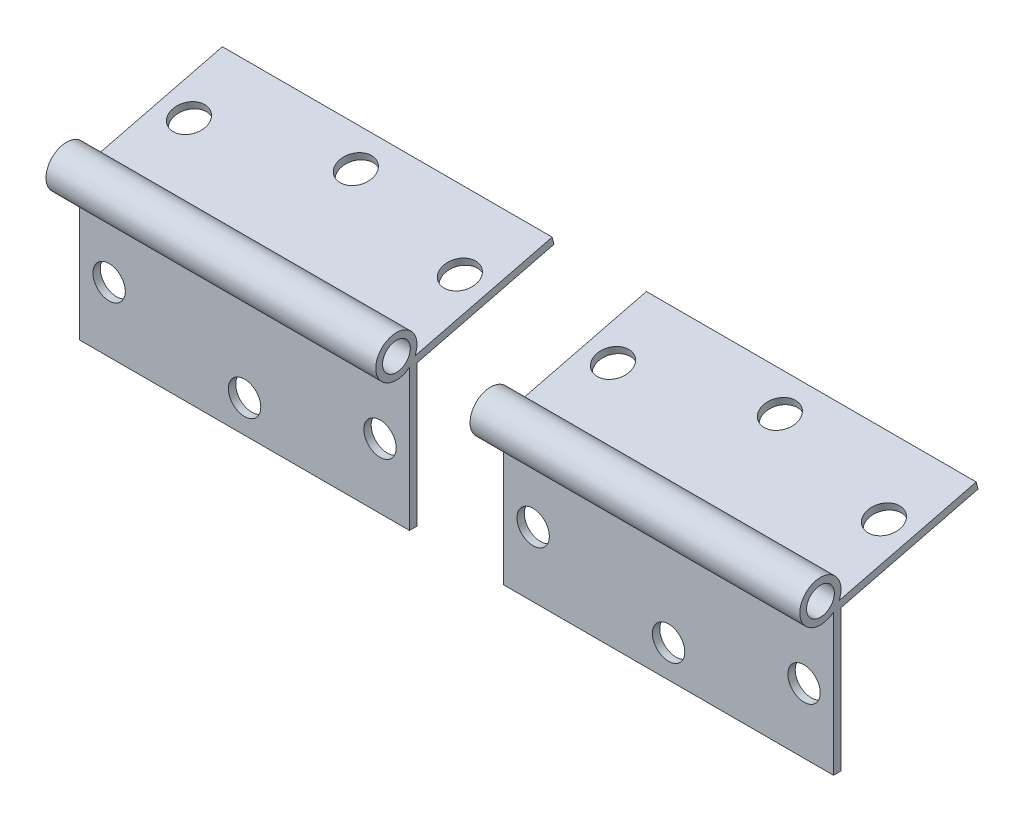
ISO-10303-21;
HEADER;
FILE_DESCRIPTION(('STEP AP214'),'2;1');
FILE_NAME('part.step','',(''),(''),'','','');
FILE_SCHEMA(('AUTOMOTIVE_DESIGN { 1 0 10303 214 1 1 1 1 }'));
ENDSEC;
DATA;
#1=APPLICATION_CONTEXT('core data for automotive mechanical design processes');
#2=APPLICATION_PROTOCOL_DEFINITION('international standard','automotive_design',2000,#1);
#3=PRODUCT_CONTEXT('',#1,'mechanical');
#4=PRODUCT('Part','Part','',(#3));
#5=PRODUCT_RELATED_PRODUCT_CATEGORY('part','',(#4));
#6=PRODUCT_DEFINITION_FORMATION('','',#4);
#7=PRODUCT_DEFINITION_CONTEXT('part definition',#1,'design');
#8=PRODUCT_DEFINITION('design','',#6,#7);
#9=PRODUCT_DEFINITION_SHAPE('','',#8);
#10=(LENGTH_UNIT() NAMED_UNIT(*) SI_UNIT(.MILLI.,.METRE.));
#11=(NAMED_UNIT(*) PLANE_ANGLE_UNIT() SI_UNIT($,.RADIAN.));
#12=(NAMED_UNIT(*) SI_UNIT($,.STERADIAN.) SOLID_ANGLE_UNIT());
#13=UNCERTAINTY_MEASURE_WITH_UNIT(LENGTH_MEASURE(1.E-05),#10,'distance_accuracy_value','');
#14=(GEOMETRIC_REPRESENTATION_CONTEXT(3) GLOBAL_UNCERTAINTY_ASSIGNED_CONTEXT((#13)) GLOBAL_UNIT_ASSIGNED_CONTEXT((#10,
#11,#12)) REPRESENTATION_CONTEXT('',''));
#15=CARTESIAN_POINT('',(0.,0.,0.));
#16=DIRECTION('',(0.,0.,1.));
#17=DIRECTION('',(1.,0.,0.));
#18=AXIS2_PLACEMENT_3D('',#15,#16,#17);
#19=CARTESIAN_POINT('',(101.6,0.,0.));
#20=DIRECTION('',(-1.,0.,0.));
#21=DIRECTION('',(0.,0.,1.));
#22=AXIS2_PLACEMENT_3D('',#19,#20,#21);
#23=CYLINDRICAL_SURFACE('',#22,3.75065009492908);
#24=CARTESIAN_POINT('',(-101.6,0.,0.));
#25=DIRECTION('',(1.,0.,0.));
#26=DIRECTION('',(0.,0.,-1.));
#27=AXIS2_PLACEMENT_3D('',#24,#25,#26);
#28=CIRCLE('',#27,3.75065009492908);
#29=CARTESIAN_POINT('',(-101.6,0.,-3.75065009492908));
#30=VERTEX_POINT('',#29);
#31=EDGE_CURVE('E122',#30,#30,#28,.T.);
#32=ORIENTED_EDGE('',*,*,#31,.F.);
#33=EDGE_LOOP('',(#32));
#34=FACE_BOUND('',#33,.T.);
#35=CARTESIAN_POINT('',(-12.7,0.,0.));
#36=DIRECTION('',(-1.,0.,0.));
#37=DIRECTION('',(0.,0.,1.));
#38=AXIS2_PLACEMENT_3D('',#35,#36,#37);
#39=CIRCLE('',#38,3.75065009492908);
#40=CARTESIAN_POINT('',(-12.7,0.,3.75065009492908));
#41=VERTEX_POINT('',#40);
#42=EDGE_CURVE('E12',#41,#41,#39,.T.);
#43=ORIENTED_EDGE('',*,*,#42,.F.);
#44=EDGE_LOOP('',(#43));
#45=FACE_BOUND('',#44,.T.);
#46=ADVANCED_FACE('F43',(#34,#45),#23,.F.);
#47=CARTESIAN_POINT('',(101.6,0.,0.));
#48=DIRECTION('',(-1.,0.,0.));
#49=DIRECTION('',(0.,0.,1.));
#50=AXIS2_PLACEMENT_3D('',#47,#48,#49);
#51=CYLINDRICAL_SURFACE('',#50,5.55625);
#52=CARTESIAN_POINT('',(-12.7,0.,0.));
#53=DIRECTION('',(-1.,0.,0.));
#54=DIRECTION('',(0.,0.,1.));
#55=AXIS2_PLACEMENT_3D('',#52,#53,#54);
#56=CIRCLE('',#55,5.55625);
#57=CARTESIAN_POINT('',(-12.7,-4.29976832770399,-3.51907749141357));
#58=VERTEX_POINT('',#57);
#59=CARTESIAN_POINT('',(-12.7,-2.37433774587505,-5.02338872983298));
#60=VERTEX_POINT('',#59);
#61=EDGE_CURVE('E60',#58,#60,#56,.T.);
#62=ORIENTED_EDGE('',*,*,#61,.T.);
#63=DIRECTION('',(-1.,0.,0.));
#64=VECTOR('',#63,1.);
#65=CARTESIAN_POINT('',(101.6,-2.37433774587505,-5.02338872983297));
#66=LINE('',#65,#64);
#67=CARTESIAN_POINT('',(-101.6,-2.37433774587505,-5.02338872983297));
#68=VERTEX_POINT('',#67);
#69=EDGE_CURVE('E174',#60,#68,#66,.T.);
#70=ORIENTED_EDGE('',*,*,#69,.T.);
#71=CARTESIAN_POINT('',(-101.6,0.,0.));
#72=DIRECTION('',(1.,0.,0.));
#73=DIRECTION('',(0.,0.,-1.));
#74=AXIS2_PLACEMENT_3D('',#71,#72,#73);
#75=CIRCLE('',#74,5.55625);
#76=CARTESIAN_POINT('',(-101.6,-4.29976832770398,-3.51907749141357));
#77=VERTEX_POINT('',#76);
#78=EDGE_CURVE('E136',#68,#77,#75,.T.);
#79=ORIENTED_EDGE('',*,*,#78,.T.);
#80=DIRECTION('',(-1.,0.,0.));
#81=VECTOR('',#80,1.);
#82=CARTESIAN_POINT('',(101.6,-4.29976832770398,-3.51907749141357));
#83=LINE('',#82,#81);
#84=EDGE_CURVE('E138',#58,#77,#83,.T.);
#85=ORIENTED_EDGE('',*,*,#84,.F.);
#86=EDGE_LOOP('',(#62,#70,#79,#85));
#87=FACE_BOUND('',#86,.T.);
#88=ADVANCED_FACE('F201',(#87),#51,.T.);
#89=CARTESIAN_POINT('',(101.6,0.,-3.51907749141357));
#90=DIRECTION('',(0.,0.,1.));
#91=DIRECTION('',(1.,0.,0.));
#92=AXIS2_PLACEMENT_3D('',#89,#90,#91);
#93=PLANE('',#92);
#94=CARTESIAN_POINT('',(-57.15,-33.668518327704,-3.51907749141357));
#95=DIRECTION('',(0.,0.,1.));
#96=DIRECTION('',(1.,0.,0.));
#97=AXIS2_PLACEMENT_3D('',#94,#95,#96);
#98=CIRCLE('',#97,4.365625);
#99=CARTESIAN_POINT('',(-52.784375,-33.668518327704,-3.51907749141357));
#100=VERTEX_POINT('',#99);
#101=EDGE_CURVE('E182',#100,#100,#98,.T.);
#102=ORIENTED_EDGE('',*,*,#101,.F.);
#103=EDGE_LOOP('',(#102));
#104=FACE_BOUND('',#103,.T.);
#105=CARTESIAN_POINT('',(-20.6375,-24.937268327704,-3.51907749141357));
#106=DIRECTION('',(0.,0.,1.));
#107=DIRECTION('',(1.,0.,0.));
#108=AXIS2_PLACEMENT_3D('',#105,#106,#107);
#109=CIRCLE('',#108,4.365625);
#110=CARTESIAN_POINT('',(-16.271875,-24.937268327704,-3.51907749141357));
#111=VERTEX_POINT('',#110);
#112=EDGE_CURVE('E188',#111,#111,#109,.T.);
#113=ORIENTED_EDGE('',*,*,#112,.F.);
#114=EDGE_LOOP('',(#113));
#115=FACE_BOUND('',#114,.T.);
#116=CARTESIAN_POINT('',(-93.6625,-24.937268327704,-3.51907749141357));
#117=DIRECTION('',(0.,0.,1.));
#118=DIRECTION('',(1.,0.,0.));
#119=AXIS2_PLACEMENT_3D('',#116,#117,#118);
#120=CIRCLE('',#119,4.365625);
#121=CARTESIAN_POINT('',(-89.296875,-24.937268327704,-3.51907749141357));
#122=VERTEX_POINT('',#121);
#123=EDGE_CURVE('E129',#122,#122,#120,.T.);
#124=ORIENTED_EDGE('',*,*,#123,.F.);
#125=EDGE_LOOP('',(#124));
#126=FACE_BOUND('',#125,.T.);
#127=DIRECTION('',(0.,-1.,0.));
#128=VECTOR('',#127,1.);
#129=CARTESIAN_POINT('',(-12.7,0.,-3.51907749141357));
#130=LINE('',#129,#128);
#131=CARTESIAN_POINT('',(-12.7,-42.399768327704,-3.51907749141357));
#132=VERTEX_POINT('',#131);
#133=EDGE_CURVE('E52',#58,#132,#130,.T.);
#134=ORIENTED_EDGE('',*,*,#133,.F.);
#135=ORIENTED_EDGE('',*,*,#84,.T.);
#136=DIRECTION('',(0.,1.,0.));
#137=VECTOR('',#136,1.);
#138=CARTESIAN_POINT('',(-101.6,0.,-3.51907749141357));
#139=LINE('',#138,#137);
#140=CARTESIAN_POINT('',(-101.6,-42.399768327704,-3.51907749141357));
#141=VERTEX_POINT('',#140);
#142=EDGE_CURVE('E133',#141,#77,#139,.T.);
#143=ORIENTED_EDGE('',*,*,#142,.F.);
#144=DIRECTION('',(-1.,0.,0.));
#145=VECTOR('',#144,1.);
#146=CARTESIAN_POINT('',(101.6,-42.399768327704,-3.51907749141357));
#147=LINE('',#146,#145);
#148=EDGE_CURVE('E118',#132,#141,#147,.T.);
#149=ORIENTED_EDGE('',*,*,#148,.F.);
#150=EDGE_LOOP('',(#134,#135,#143,#149));
#151=FACE_BOUND('',#150,.T.);
#152=ADVANCED_FACE('F151',(#104,#115,#126,#151),#93,.T.);
#153=CARTESIAN_POINT('',(101.6,-42.399768327704,0.));
#154=DIRECTION('',(0.,-1.,0.));
#155=DIRECTION('',(0.,0.,-1.));
#156=AXIS2_PLACEMENT_3D('',#153,#154,#155);
#157=PLANE('',#156);
#158=DIRECTION('',(0.,0.,1.));
#159=VECTOR('',#158,1.);
#160=CARTESIAN_POINT('',(-12.7,-42.399768327704,-5.50345249141358));
#161=LINE('',#160,#159);
#162=CARTESIAN_POINT('',(-12.7,-42.399768327704,-5.50345249141358));
#163=VERTEX_POINT('',#162);
#164=EDGE_CURVE('E117',#163,#132,#161,.T.);
#165=ORIENTED_EDGE('',*,*,#164,.T.);
#166=ORIENTED_EDGE('',*,*,#148,.T.);
#167=DIRECTION('',(0.,0.,1.));
#168=VECTOR('',#167,1.);
#169=CARTESIAN_POINT('',(-101.6,-42.399768327704,0.));
#170=LINE('',#169,#168);
#171=CARTESIAN_POINT('',(-101.6,-42.399768327704,-5.50345249141358));
#172=VERTEX_POINT('',#171);
#173=EDGE_CURVE('E124',#172,#141,#170,.T.);
#174=ORIENTED_EDGE('',*,*,#173,.F.);
#175=DIRECTION('',(-1.,0.,0.));
#176=VECTOR('',#175,1.);
#177=CARTESIAN_POINT('',(101.6,-42.399768327704,-5.50345249141358));
#178=LINE('',#177,#176);
#179=EDGE_CURVE('E76',#163,#172,#178,.T.);
#180=ORIENTED_EDGE('',*,*,#179,.F.);
#181=EDGE_LOOP('',(#165,#166,#174,#180));
#182=FACE_BOUND('',#181,.T.);
#183=ADVANCED_FACE('F149',(#182),#157,.T.);
#184=CARTESIAN_POINT('',(101.6,0.,-5.50345249141358));
#185=DIRECTION('',(0.,0.,1.));
#186=DIRECTION('',(1.,0.,0.));
#187=AXIS2_PLACEMENT_3D('',#184,#185,#186);
#188=PLANE('',#187);
#189=CARTESIAN_POINT('',(-57.15,-33.668518327704,-5.50345249141358));
#190=DIRECTION('',(0.,0.,1.));
#191=DIRECTION('',(1.,0.,0.));
#192=AXIS2_PLACEMENT_3D('',#189,#190,#191);
#193=CIRCLE('',#192,4.365625);
#194=CARTESIAN_POINT('',(-52.784375,-33.668518327704,-5.50345249141358));
#195=VERTEX_POINT('',#194);
#196=EDGE_CURVE('E172',#195,#195,#193,.T.);
#197=ORIENTED_EDGE('',*,*,#196,.T.);
#198=EDGE_LOOP('',(#197));
#199=FACE_BOUND('',#198,.T.);
#200=CARTESIAN_POINT('',(-20.6375,-24.937268327704,-5.50345249141358));
#201=DIRECTION('',(0.,0.,1.));
#202=DIRECTION('',(1.,0.,0.));
#203=AXIS2_PLACEMENT_3D('',#200,#201,#202);
#204=CIRCLE('',#203,4.365625);
#205=CARTESIAN_POINT('',(-16.271875,-24.937268327704,-5.50345249141358));
#206=VERTEX_POINT('',#205);
#207=EDGE_CURVE('E185',#206,#206,#204,.T.);
#208=ORIENTED_EDGE('',*,*,#207,.T.);
#209=EDGE_LOOP('',(#208));
#210=FACE_BOUND('',#209,.T.);
#211=CARTESIAN_POINT('',(-93.6625,-24.937268327704,-5.50345249141358));
#212=DIRECTION('',(0.,0.,1.));
#213=DIRECTION('',(1.,0.,0.));
#214=AXIS2_PLACEMENT_3D('',#211,#212,#213);
#215=CIRCLE('',#214,4.365625);
#216=CARTESIAN_POINT('',(-89.296875,-24.937268327704,-5.50345249141358));
#217=VERTEX_POINT('',#216);
#218=EDGE_CURVE('E190',#217,#217,#215,.T.);
#219=ORIENTED_EDGE('',*,*,#218,.T.);
#220=EDGE_LOOP('',(#219));
#221=FACE_BOUND('',#220,.T.);
#222=DIRECTION('',(-1.,0.,0.));
#223=VECTOR('',#222,1.);
#224=CARTESIAN_POINT('',(101.6,-4.29976832770399,-5.50345249141358));
#225=LINE('',#224,#223);
#226=CARTESIAN_POINT('',(-12.7,-4.29976832770398,-5.50345249141358));
#227=VERTEX_POINT('',#226);
#228=CARTESIAN_POINT('',(-101.6,-4.29976832770398,-5.50345249141358));
#229=VERTEX_POINT('',#228);
#230=EDGE_CURVE('E46',#227,#229,#225,.T.);
#231=ORIENTED_EDGE('',*,*,#230,.F.);
#232=DIRECTION('',(0.,-1.,0.));
#233=VECTOR('',#232,1.);
#234=CARTESIAN_POINT('',(-12.7,-42.399768327704,-5.50345249141358));
#235=LINE('',#234,#233);
#236=EDGE_CURVE('E114',#227,#163,#235,.T.);
#237=ORIENTED_EDGE('',*,*,#236,.T.);
#238=ORIENTED_EDGE('',*,*,#179,.T.);
#239=DIRECTION('',(0.,1.,0.));
#240=VECTOR('',#239,1.);
#241=CARTESIAN_POINT('',(-101.6,0.,-5.50345249141358));
#242=LINE('',#241,#240);
#243=EDGE_CURVE('E121',#172,#229,#242,.T.);
#244=ORIENTED_EDGE('',*,*,#243,.T.);
#245=EDGE_LOOP('',(#231,#237,#238,#244));
#246=FACE_BOUND('',#245,.T.);
#247=ADVANCED_FACE('F120',(#199,#210,#221,#246),#188,.F.);
#248=CARTESIAN_POINT('',(-101.6,0.,0.));
#249=DIRECTION('',(1.,0.,0.));
#250=DIRECTION('',(0.,0.,-1.));
#251=AXIS2_PLACEMENT_3D('',#248,#249,#250);
#252=PLANE('',#251);
#253=ORIENTED_EDGE('',*,*,#31,.T.);
#254=EDGE_LOOP('',(#253));
#255=FACE_BOUND('',#254,.T.);
#256=ORIENTED_EDGE('',*,*,#78,.F.);
#257=DIRECTION('',(0.,-0.241921895599674,0.970295726275995));
#258=VECTOR('',#257,1.);
#259=CARTESIAN_POINT('',(-101.6,-3.41454585035264,-0.851341897484917));
#260=LINE('',#259,#258);
#261=CARTESIAN_POINT('',(-101.6,6.84288647647254,-41.9916559009484));
#262=VERTEX_POINT('',#261);
#263=EDGE_CURVE('E160',#262,#68,#260,.T.);
#264=ORIENTED_EDGE('',*,*,#263,.F.);
#265=DIRECTION('',(0.,0.970295726275995,0.241921895599674));
#266=VECTOR('',#265,1.);
#267=CARTESIAN_POINT('',(-101.6,10.2574323268252,-41.1403140034635));
#268=LINE('',#267,#266);
#269=CARTESIAN_POINT('',(-101.6,4.9174558946436,-42.471719662529));
#270=VERTEX_POINT('',#269);
#271=EDGE_CURVE('E158',#270,#262,#268,.T.);
#272=ORIENTED_EDGE('',*,*,#271,.F.);
#273=DIRECTION('',(0.,-0.241921895599674,0.970295726275995));
#274=VECTOR('',#273,1.);
#275=CARTESIAN_POINT('',(-101.6,-5.33997643218157,-1.33140565906552));
#276=LINE('',#275,#274);
#277=EDGE_CURVE('E156',#270,#229,#276,.T.);
#278=ORIENTED_EDGE('',*,*,#277,.T.);
#279=ORIENTED_EDGE('',*,*,#243,.F.);
#280=ORIENTED_EDGE('',*,*,#173,.T.);
#281=ORIENTED_EDGE('',*,*,#142,.T.);
#282=EDGE_LOOP('',(#256,#264,#272,#278,#279,#280,#281));
#283=FACE_BOUND('',#282,.T.);
#284=ADVANCED_FACE('F154',(#255,#283),#252,.F.);
#285=CARTESIAN_POINT('',(-12.7,-42.399768327704,-5.50345249141358));
#286=DIRECTION('',(-1.,0.,0.));
#287=DIRECTION('',(0.,0.,1.));
#288=AXIS2_PLACEMENT_3D('',#285,#286,#287);
#289=PLANE('',#288);
#290=DIRECTION('',(0.,0.241921895599674,-0.970295726275995));
#291=VECTOR('',#290,1.);
#292=CARTESIAN_POINT('',(-12.7,-3.41454585035264,-0.851341897484917));
#293=LINE('',#292,#291);
#294=CARTESIAN_POINT('',(-12.7,6.84288647647253,-41.9916559009484));
#295=VERTEX_POINT('',#294);
#296=EDGE_CURVE('E169',#60,#295,#293,.T.);
#297=ORIENTED_EDGE('',*,*,#296,.F.);
#298=ORIENTED_EDGE('',*,*,#61,.F.);
#299=ORIENTED_EDGE('',*,*,#133,.T.);
#300=ORIENTED_EDGE('',*,*,#164,.F.);
#301=ORIENTED_EDGE('',*,*,#236,.F.);
#302=DIRECTION('',(0.,0.241921895599674,-0.970295726275995));
#303=VECTOR('',#302,1.);
#304=CARTESIAN_POINT('',(-12.7,4.9174558946436,-42.471719662529));
#305=LINE('',#304,#303);
#306=CARTESIAN_POINT('',(-12.7,4.9174558946436,-42.471719662529));
#307=VERTEX_POINT('',#306);
#308=EDGE_CURVE('E105',#227,#307,#305,.T.);
#309=ORIENTED_EDGE('',*,*,#308,.T.);
#310=DIRECTION('',(0.,0.970295726275995,0.241921895599674));
#311=VECTOR('',#310,1.);
#312=CARTESIAN_POINT('',(-12.7,4.9174558946436,-42.471719662529));
#313=LINE('',#312,#311);
#314=EDGE_CURVE('E173',#307,#295,#313,.T.);
#315=ORIENTED_EDGE('',*,*,#314,.T.);
#316=EDGE_LOOP('',(#297,#298,#299,#300,#301,#309,#315));
#317=FACE_BOUND('',#316,.T.);
#318=ORIENTED_EDGE('',*,*,#42,.T.);
#319=EDGE_LOOP('',(#318));
#320=FACE_BOUND('',#319,.T.);
#321=ADVANCED_FACE('F115',(#317,#320),#289,.F.);
#322=CARTESIAN_POINT('',(-93.6625,-24.937268327704,-5.50345249141358));
#323=DIRECTION('',(0.,0.,1.));
#324=DIRECTION('',(1.,0.,0.));
#325=AXIS2_PLACEMENT_3D('',#322,#323,#324);
#326=CYLINDRICAL_SURFACE('',#325,4.365625);
#327=ORIENTED_EDGE('',*,*,#123,.T.);
#328=EDGE_LOOP('',(#327));
#329=FACE_BOUND('',#328,.T.);
#330=ORIENTED_EDGE('',*,*,#218,.F.);
#331=EDGE_LOOP('',(#330));
#332=FACE_BOUND('',#331,.T.);
#333=ADVANCED_FACE('F197',(#329,#332),#326,.F.);
#334=CARTESIAN_POINT('',(-20.6375,-24.937268327704,-5.50345249141358));
#335=DIRECTION('',(0.,0.,1.));
#336=DIRECTION('',(1.,0.,0.));
#337=AXIS2_PLACEMENT_3D('',#334,#335,#336);
#338=CYLINDRICAL_SURFACE('',#337,4.365625);
#339=ORIENTED_EDGE('',*,*,#112,.T.);
#340=EDGE_LOOP('',(#339));
#341=FACE_BOUND('',#340,.T.);
#342=ORIENTED_EDGE('',*,*,#207,.F.);
#343=EDGE_LOOP('',(#342));
#344=FACE_BOUND('',#343,.T.);
#345=ADVANCED_FACE('F225',(#341,#344),#338,.F.);
#346=CARTESIAN_POINT('',(-57.15,-33.668518327704,-5.50345249141358));
#347=DIRECTION('',(0.,0.,1.));
#348=DIRECTION('',(1.,0.,0.));
#349=AXIS2_PLACEMENT_3D('',#346,#347,#348);
#350=CYLINDRICAL_SURFACE('',#349,4.365625);
#351=ORIENTED_EDGE('',*,*,#101,.T.);
#352=EDGE_LOOP('',(#351));
#353=FACE_BOUND('',#352,.T.);
#354=ORIENTED_EDGE('',*,*,#196,.F.);
#355=EDGE_LOOP('',(#354));
#356=FACE_BOUND('',#355,.T.);
#357=ADVANCED_FACE('F239',(#353,#356),#350,.F.);
#358=CARTESIAN_POINT('',(101.6,-3.41454585035264,-0.851341897484917));
#359=DIRECTION('',(0.,0.970295726275995,0.241921895599674));
#360=DIRECTION('',(1.,0.,0.));
#361=AXIS2_PLACEMENT_3D('',#358,#359,#360);
#362=PLANE('',#361);
#363=CARTESIAN_POINT('',(-57.15,4.73060592551788,-33.5197613409011));
#364=DIRECTION('',(0.,-0.970295726275995,-0.241921895599674));
#365=DIRECTION('',(1.,0.,0.));
#366=AXIS2_PLACEMENT_3D('',#363,#364,#365);
#367=CIRCLE('',#366,4.365625);
#368=CARTESIAN_POINT('',(-52.784375,4.73060592551788,-33.5197613409011));
#369=VERTEX_POINT('',#368);
#370=EDGE_CURVE('E275',#369,#369,#367,.T.);
#371=ORIENTED_EDGE('',*,*,#370,.T.);
#372=EDGE_LOOP('',(#371));
#373=FACE_BOUND('',#372,.T.);
#374=CARTESIAN_POINT('',(-20.6375,2.61832537456323,-25.0478667808538));
#375=DIRECTION('',(0.,-0.970295726275995,-0.241921895599674));
#376=DIRECTION('',(1.,0.,0.));
#377=AXIS2_PLACEMENT_3D('',#374,#375,#376);
#378=CIRCLE('',#377,4.365625);
#379=CARTESIAN_POINT('',(-16.271875,2.61832537456323,-25.0478667808538));
#380=VERTEX_POINT('',#379);
#381=EDGE_CURVE('E285',#380,#380,#378,.T.);
#382=ORIENTED_EDGE('',*,*,#381,.T.);
#383=EDGE_LOOP('',(#382));
#384=FACE_BOUND('',#383,.T.);
#385=CARTESIAN_POINT('',(-93.6625,2.61832537456323,-25.0478667808538));
#386=DIRECTION('',(0.,-0.970295726275995,-0.241921895599674));
#387=DIRECTION('',(1.,0.,0.));
#388=AXIS2_PLACEMENT_3D('',#385,#386,#387);
#389=CIRCLE('',#388,4.365625);
#390=CARTESIAN_POINT('',(-89.296875,2.61832537456323,-25.0478667808538));
#391=VERTEX_POINT('',#390);
#392=EDGE_CURVE('E164',#391,#391,#389,.T.);
#393=ORIENTED_EDGE('',*,*,#392,.T.);
#394=EDGE_LOOP('',(#393));
#395=FACE_BOUND('',#394,.T.);
#396=ORIENTED_EDGE('',*,*,#296,.T.);
#397=DIRECTION('',(-1.,0.,0.));
#398=VECTOR('',#397,1.);
#399=CARTESIAN_POINT('',(101.6,6.84288647647254,-41.9916559009484));
#400=LINE('',#399,#398);
#401=EDGE_CURVE('E112',#295,#262,#400,.T.);
#402=ORIENTED_EDGE('',*,*,#401,.T.);
#403=ORIENTED_EDGE('',*,*,#263,.T.);
#404=ORIENTED_EDGE('',*,*,#69,.F.);
#405=EDGE_LOOP('',(#396,#402,#403,#404));
#406=FACE_BOUND('',#405,.T.);
#407=ADVANCED_FACE('F245',(#373,#384,#395,#406),#362,.T.);
#408=CARTESIAN_POINT('',(101.6,10.2574323268252,-41.1403140034635));
#409=DIRECTION('',(0.,0.241921895599674,-0.970295726275995));
#410=DIRECTION('',(0.,-0.970295726275995,-0.241921895599674));
#411=AXIS2_PLACEMENT_3D('',#408,#409,#410);
#412=PLANE('',#411);
#413=ORIENTED_EDGE('',*,*,#314,.F.);
#414=DIRECTION('',(-1.,0.,0.));
#415=VECTOR('',#414,1.);
#416=CARTESIAN_POINT('',(101.6,4.9174558946436,-42.471719662529));
#417=LINE('',#416,#415);
#418=EDGE_CURVE('E110',#307,#270,#417,.T.);
#419=ORIENTED_EDGE('',*,*,#418,.T.);
#420=ORIENTED_EDGE('',*,*,#271,.T.);
#421=ORIENTED_EDGE('',*,*,#401,.F.);
#422=EDGE_LOOP('',(#413,#419,#420,#421));
#423=FACE_BOUND('',#422,.T.);
#424=ADVANCED_FACE('F251',(#423),#412,.T.);
#425=CARTESIAN_POINT('',(101.6,-5.33997643218157,-1.33140565906552));
#426=DIRECTION('',(0.,0.970295726275995,0.241921895599674));
#427=DIRECTION('',(1.,0.,0.));
#428=AXIS2_PLACEMENT_3D('',#425,#426,#427);
#429=PLANE('',#428);
#430=CARTESIAN_POINT('',(-57.15,2.80517534368894,-33.9998251024817));
#431=DIRECTION('',(0.,-0.970295726275995,-0.241921895599674));
#432=DIRECTION('',(1.,0.,0.));
#433=AXIS2_PLACEMENT_3D('',#430,#431,#432);
#434=CIRCLE('',#433,4.365625);
#435=CARTESIAN_POINT('',(-52.784375,2.80517534368894,-33.9998251024817));
#436=VERTEX_POINT('',#435);
#437=EDGE_CURVE('E278',#436,#436,#434,.T.);
#438=ORIENTED_EDGE('',*,*,#437,.F.);
#439=EDGE_LOOP('',(#438));
#440=FACE_BOUND('',#439,.T.);
#441=CARTESIAN_POINT('',(-20.6375,0.69289479273429,-25.5279305424344));
#442=DIRECTION('',(0.,-0.970295726275995,-0.241921895599674));
#443=DIRECTION('',(1.,0.,0.));
#444=AXIS2_PLACEMENT_3D('',#441,#442,#443);
#445=CIRCLE('',#444,4.365625);
#446=CARTESIAN_POINT('',(-16.271875,0.69289479273429,-25.5279305424344));
#447=VERTEX_POINT('',#446);
#448=EDGE_CURVE('E280',#447,#447,#445,.T.);
#449=ORIENTED_EDGE('',*,*,#448,.F.);
#450=EDGE_LOOP('',(#449));
#451=FACE_BOUND('',#450,.T.);
#452=CARTESIAN_POINT('',(-93.6625,0.69289479273429,-25.5279305424344));
#453=DIRECTION('',(0.,-0.970295726275995,-0.241921895599674));
#454=DIRECTION('',(1.,0.,0.));
#455=AXIS2_PLACEMENT_3D('',#452,#453,#454);
#456=CIRCLE('',#455,4.365625);
#457=CARTESIAN_POINT('',(-89.296875,0.69289479273429,-25.5279305424344));
#458=VERTEX_POINT('',#457);
#459=EDGE_CURVE('E287',#458,#458,#456,.T.);
#460=ORIENTED_EDGE('',*,*,#459,.F.);
#461=EDGE_LOOP('',(#460));
#462=FACE_BOUND('',#461,.T.);
#463=ORIENTED_EDGE('',*,*,#230,.T.);
#464=ORIENTED_EDGE('',*,*,#277,.F.);
#465=ORIENTED_EDGE('',*,*,#418,.F.);
#466=ORIENTED_EDGE('',*,*,#308,.F.);
#467=EDGE_LOOP('',(#463,#464,#465,#466));
#468=FACE_BOUND('',#467,.T.);
#469=ADVANCED_FACE('F107',(#440,#451,#462,#468),#429,.F.);
#470=CARTESIAN_POINT('',(-93.6625,0.69289479273429,-25.5279305424344));
#471=DIRECTION('',(0.,0.970295726275995,0.241921895599674));
#472=DIRECTION('',(1.,0.,0.));
#473=AXIS2_PLACEMENT_3D('',#470,#471,#472);
#474=CYLINDRICAL_SURFACE('',#473,4.365625);
#475=ORIENTED_EDGE('',*,*,#392,.F.);
#476=EDGE_LOOP('',(#475));
#477=FACE_BOUND('',#476,.T.);
#478=ORIENTED_EDGE('',*,*,#459,.T.);
#479=EDGE_LOOP('',(#478));
#480=FACE_BOUND('',#479,.T.);
#481=ADVANCED_FACE('F258',(#477,#480),#474,.F.);
#482=CARTESIAN_POINT('',(-20.6375,0.69289479273429,-25.5279305424344));
#483=DIRECTION('',(0.,0.970295726275995,0.241921895599674));
#484=DIRECTION('',(1.,0.,0.));
#485=AXIS2_PLACEMENT_3D('',#482,#483,#484);
#486=CYLINDRICAL_SURFACE('',#485,4.365625);
#487=ORIENTED_EDGE('',*,*,#381,.F.);
#488=EDGE_LOOP('',(#487));
#489=FACE_BOUND('',#488,.T.);
#490=ORIENTED_EDGE('',*,*,#448,.T.);
#491=EDGE_LOOP('',(#490));
#492=FACE_BOUND('',#491,.T.);
#493=ADVANCED_FACE('F262',(#489,#492),#486,.F.);
#494=CARTESIAN_POINT('',(-57.15,2.80517534368894,-33.9998251024817));
#495=DIRECTION('',(0.,0.970295726275995,0.241921895599674));
#496=DIRECTION('',(1.,0.,0.));
#497=AXIS2_PLACEMENT_3D('',#494,#495,#496);
#498=CYLINDRICAL_SURFACE('',#497,4.365625);
#499=ORIENTED_EDGE('',*,*,#370,.F.);
#500=EDGE_LOOP('',(#499));
#501=FACE_BOUND('',#500,.T.);
#502=ORIENTED_EDGE('',*,*,#437,.T.);
#503=EDGE_LOOP('',(#502));
#504=FACE_BOUND('',#503,.T.);
#505=ADVANCED_FACE('F266',(#501,#504),#498,.F.);
#506=CLOSED_SHELL('',(#46,#88,#152,#183,#247,#284,#321,#333,#345,#357,#407,#424,#469,#481,#493,#505));
#507=MANIFOLD_SOLID_BREP('B2',#506);
#508=CARTESIAN_POINT('',(101.6,0.,0.));
#509=DIRECTION('',(1.,0.,0.));
#510=DIRECTION('',(0.,0.,-1.));
#511=AXIS2_PLACEMENT_3D('',#508,#509,#510);
#512=PLANE('',#511);
#513=DIRECTION('',(0.,1.,0.));
#514=VECTOR('',#513,1.);
#515=CARTESIAN_POINT('',(101.6,0.,-5.50345249141358));
#516=LINE('',#515,#514);
#517=CARTESIAN_POINT('',(101.6,-42.399768327704,-5.50345249141358));
#518=VERTEX_POINT('',#517);
#519=CARTESIAN_POINT('',(101.6,-4.29976832770398,-5.50345249141358));
#520=VERTEX_POINT('',#519);
#521=EDGE_CURVE('E533',#518,#520,#516,.T.);
#522=ORIENTED_EDGE('',*,*,#521,.T.);
#523=DIRECTION('',(0.,-0.241921895599674,0.970295726275995));
#524=VECTOR('',#523,1.);
#525=CARTESIAN_POINT('',(101.6,-5.33997643218157,-1.33140565906552));
#526=LINE('',#525,#524);
#527=CARTESIAN_POINT('',(101.6,4.9174558946436,-42.471719662529));
#528=VERTEX_POINT('',#527);
#529=EDGE_CURVE('E481',#528,#520,#526,.T.);
#530=ORIENTED_EDGE('',*,*,#529,.F.);
#531=DIRECTION('',(0.,0.970295726275995,0.241921895599674));
#532=VECTOR('',#531,1.);
#533=CARTESIAN_POINT('',(101.6,10.2574323268252,-41.1403140034635));
#534=LINE('',#533,#532);
#535=CARTESIAN_POINT('',(101.6,6.84288647647254,-41.9916559009484));
#536=VERTEX_POINT('',#535);
#537=EDGE_CURVE('E478',#528,#536,#534,.T.);
#538=ORIENTED_EDGE('',*,*,#537,.T.);
#539=DIRECTION('',(0.,-0.241921895599674,0.970295726275995));
#540=VECTOR('',#539,1.);
#541=CARTESIAN_POINT('',(101.6,-3.41454585035264,-0.851341897484917));
#542=LINE('',#541,#540);
#543=CARTESIAN_POINT('',(101.6,-2.37433774587505,-5.02338872983297));
#544=VERTEX_POINT('',#543);
#545=EDGE_CURVE('E560',#536,#544,#542,.T.);
#546=ORIENTED_EDGE('',*,*,#545,.T.);
#547=CARTESIAN_POINT('',(101.6,0.,0.));
#548=DIRECTION('',(1.,0.,0.));
#549=DIRECTION('',(0.,0.,-1.));
#550=AXIS2_PLACEMENT_3D('',#547,#548,#549);
#551=CIRCLE('',#550,5.55625);
#552=CARTESIAN_POINT('',(101.6,-4.29976832770398,-3.51907749141357));
#553=VERTEX_POINT('',#552);
#554=EDGE_CURVE('E527',#544,#553,#551,.T.);
#555=ORIENTED_EDGE('',*,*,#554,.T.);
#556=DIRECTION('',(0.,1.,0.));
#557=VECTOR('',#556,1.);
#558=CARTESIAN_POINT('',(101.6,0.,-3.51907749141357));
#559=LINE('',#558,#557);
#560=CARTESIAN_POINT('',(101.6,-42.399768327704,-3.51907749141357));
#561=VERTEX_POINT('',#560);
#562=EDGE_CURVE('E529',#561,#553,#559,.T.);
#563=ORIENTED_EDGE('',*,*,#562,.F.);
#564=DIRECTION('',(0.,0.,1.));
#565=VECTOR('',#564,1.);
#566=CARTESIAN_POINT('',(101.6,-42.399768327704,0.));
#567=LINE('',#566,#565);
#568=EDGE_CURVE('E531',#518,#561,#567,.T.);
#569=ORIENTED_EDGE('',*,*,#568,.F.);
#570=EDGE_LOOP('',(#522,#530,#538,#546,#555,#563,#569));
#571=FACE_BOUND('',#570,.T.);
#572=CARTESIAN_POINT('',(101.6,0.,0.));
#573=DIRECTION('',(1.,0.,0.));
#574=DIRECTION('',(0.,0.,-1.));
#575=AXIS2_PLACEMENT_3D('',#572,#573,#574);
#576=CIRCLE('',#575,3.75065009492908);
#577=CARTESIAN_POINT('',(101.6,0.,-3.75065009492908));
#578=VERTEX_POINT('',#577);
#579=EDGE_CURVE('E524',#578,#578,#576,.T.);
#580=ORIENTED_EDGE('',*,*,#579,.F.);
#581=EDGE_LOOP('',(#580));
#582=FACE_BOUND('',#581,.T.);
#583=ADVANCED_FACE('F392',(#571,#582),#512,.T.);
#584=CARTESIAN_POINT('',(101.6,0.,-5.50345249141358));
#585=DIRECTION('',(0.,0.,1.));
#586=DIRECTION('',(1.,0.,0.));
#587=AXIS2_PLACEMENT_3D('',#584,#585,#586);
#588=PLANE('',#587);
#589=CARTESIAN_POINT('',(57.15,-33.6685183277041,-5.50345249141358));
#590=DIRECTION('',(0.,0.,1.));
#591=DIRECTION('',(-1.,0.,0.));
#592=AXIS2_PLACEMENT_3D('',#589,#590,#591);
#593=CIRCLE('',#592,4.365625);
#594=CARTESIAN_POINT('',(52.784375,-33.6685183277041,-5.50345249141358));
#595=VERTEX_POINT('',#594);
#596=EDGE_CURVE('E490',#595,#595,#593,.T.);
#597=ORIENTED_EDGE('',*,*,#596,.T.);
#598=EDGE_LOOP('',(#597));
#599=FACE_BOUND('',#598,.T.);
#600=CARTESIAN_POINT('',(93.6625,-24.9372683277041,-5.50345249141358));
#601=DIRECTION('',(0.,0.,1.));
#602=DIRECTION('',(-1.,0.,0.));
#603=AXIS2_PLACEMENT_3D('',#600,#601,#602);
#604=CIRCLE('',#603,4.365625);
#605=CARTESIAN_POINT('',(89.296875,-24.9372683277041,-5.50345249141358));
#606=VERTEX_POINT('',#605);
#607=EDGE_CURVE('E504',#606,#606,#604,.T.);
#608=ORIENTED_EDGE('',*,*,#607,.T.);
#609=EDGE_LOOP('',(#608));
#610=FACE_BOUND('',#609,.T.);
#611=CARTESIAN_POINT('',(20.6375,-24.937268327704,-5.50345249141358));
#612=DIRECTION('',(0.,0.,1.));
#613=DIRECTION('',(-1.,0.,0.));
#614=AXIS2_PLACEMENT_3D('',#611,#612,#613);
#615=CIRCLE('',#614,4.365625);
#616=CARTESIAN_POINT('',(16.271875,-24.937268327704,-5.50345249141358));
#617=VERTEX_POINT('',#616);
#618=EDGE_CURVE('E508',#617,#617,#615,.T.);
#619=ORIENTED_EDGE('',*,*,#618,.T.);
#620=EDGE_LOOP('',(#619));
#621=FACE_BOUND('',#620,.T.);
#622=DIRECTION('',(-1.,0.,0.));
#623=VECTOR('',#622,1.);
#624=CARTESIAN_POINT('',(101.6,-42.399768327704,-5.50345249141358));
#625=LINE('',#624,#623);
#626=CARTESIAN_POINT('',(12.7,-42.399768327704,-5.50345249141358));
#627=VERTEX_POINT('',#626);
#628=EDGE_CURVE('E409',#518,#627,#625,.T.);
#629=ORIENTED_EDGE('',*,*,#628,.T.);
#630=DIRECTION('',(0.,1.,0.));
#631=VECTOR('',#630,1.);
#632=CARTESIAN_POINT('',(12.7,-42.399768327704,-5.50345249141358));
#633=LINE('',#632,#631);
#634=CARTESIAN_POINT('',(12.7,-4.299768327704,-5.50345249141358));
#635=VERTEX_POINT('',#634);
#636=EDGE_CURVE('E512',#627,#635,#633,.T.);
#637=ORIENTED_EDGE('',*,*,#636,.T.);
#638=DIRECTION('',(-1.,0.,0.));
#639=VECTOR('',#638,1.);
#640=CARTESIAN_POINT('',(101.6,-4.29976832770399,-5.50345249141358));
#641=LINE('',#640,#639);
#642=EDGE_CURVE('E473',#520,#635,#641,.T.);
#643=ORIENTED_EDGE('',*,*,#642,.F.);
#644=ORIENTED_EDGE('',*,*,#521,.F.);
#645=EDGE_LOOP('',(#629,#637,#643,#644));
#646=FACE_BOUND('',#645,.T.);
#647=ADVANCED_FACE('F600',(#599,#610,#621,#646),#588,.F.);
#648=CARTESIAN_POINT('',(101.6,-42.399768327704,0.));
#649=DIRECTION('',(0.,-1.,0.));
#650=DIRECTION('',(0.,0.,-1.));
#651=AXIS2_PLACEMENT_3D('',#648,#649,#650);
#652=PLANE('',#651);
#653=DIRECTION('',(0.,0.,1.));
#654=VECTOR('',#653,1.);
#655=CARTESIAN_POINT('',(12.7,-42.399768327704,-5.50345249141358));
#656=LINE('',#655,#654);
#657=CARTESIAN_POINT('',(12.7,-42.399768327704,-3.51907749141357));
#658=VERTEX_POINT('',#657);
#659=EDGE_CURVE('E514',#627,#658,#656,.T.);
#660=ORIENTED_EDGE('',*,*,#659,.F.);
#661=ORIENTED_EDGE('',*,*,#628,.F.);
#662=ORIENTED_EDGE('',*,*,#568,.T.);
#663=DIRECTION('',(-1.,0.,0.));
#664=VECTOR('',#663,1.);
#665=CARTESIAN_POINT('',(101.6,-42.399768327704,-3.51907749141357));
#666=LINE('',#665,#664);
#667=EDGE_CURVE('E401',#561,#658,#666,.T.);
#668=ORIENTED_EDGE('',*,*,#667,.T.);
#669=EDGE_LOOP('',(#660,#661,#662,#668));
#670=FACE_BOUND('',#669,.T.);
#671=ADVANCED_FACE('F550',(#670),#652,.T.);
#672=CARTESIAN_POINT('',(101.6,0.,-3.51907749141357));
#673=DIRECTION('',(0.,0.,1.));
#674=DIRECTION('',(1.,0.,0.));
#675=AXIS2_PLACEMENT_3D('',#672,#673,#674);
#676=PLANE('',#675);
#677=CARTESIAN_POINT('',(57.15,-33.6685183277041,-3.51907749141357));
#678=DIRECTION('',(0.,0.,1.));
#679=DIRECTION('',(1.,0.,0.));
#680=AXIS2_PLACEMENT_3D('',#677,#678,#679);
#681=CIRCLE('',#680,4.365625);
#682=CARTESIAN_POINT('',(61.515625,-33.6685183277041,-3.51907749141357));
#683=VERTEX_POINT('',#682);
#684=EDGE_CURVE('E396',#683,#683,#681,.T.);
#685=ORIENTED_EDGE('',*,*,#684,.F.);
#686=EDGE_LOOP('',(#685));
#687=FACE_BOUND('',#686,.T.);
#688=CARTESIAN_POINT('',(93.6625,-24.9372683277041,-3.51907749141357));
#689=DIRECTION('',(0.,0.,1.));
#690=DIRECTION('',(1.,0.,0.));
#691=AXIS2_PLACEMENT_3D('',#688,#689,#690);
#692=CIRCLE('',#691,4.365625);
#693=CARTESIAN_POINT('',(98.028125,-24.9372683277041,-3.51907749141357));
#694=VERTEX_POINT('',#693);
#695=EDGE_CURVE('E507',#694,#694,#692,.T.);
#696=ORIENTED_EDGE('',*,*,#695,.F.);
#697=EDGE_LOOP('',(#696));
#698=FACE_BOUND('',#697,.T.);
#699=CARTESIAN_POINT('',(20.6375,-24.937268327704,-3.51907749141357));
#700=DIRECTION('',(0.,0.,1.));
#701=DIRECTION('',(1.,0.,0.));
#702=AXIS2_PLACEMENT_3D('',#699,#700,#701);
#703=CIRCLE('',#702,4.365625);
#704=CARTESIAN_POINT('',(25.003125,-24.937268327704,-3.51907749141357));
#705=VERTEX_POINT('',#704);
#706=EDGE_CURVE('E511',#705,#705,#703,.T.);
#707=ORIENTED_EDGE('',*,*,#706,.F.);
#708=EDGE_LOOP('',(#707));
#709=FACE_BOUND('',#708,.T.);
#710=DIRECTION('',(0.,1.,0.));
#711=VECTOR('',#710,1.);
#712=CARTESIAN_POINT('',(12.7,0.,-3.51907749141357));
#713=LINE('',#712,#711);
#714=CARTESIAN_POINT('',(12.7,-4.29976832770399,-3.51907749141357));
#715=VERTEX_POINT('',#714);
#716=EDGE_CURVE('E521',#658,#715,#713,.T.);
#717=ORIENTED_EDGE('',*,*,#716,.F.);
#718=ORIENTED_EDGE('',*,*,#667,.F.);
#719=ORIENTED_EDGE('',*,*,#562,.T.);
#720=DIRECTION('',(-1.,0.,0.));
#721=VECTOR('',#720,1.);
#722=CARTESIAN_POINT('',(101.6,-4.29976832770398,-3.51907749141357));
#723=LINE('',#722,#721);
#724=EDGE_CURVE('E41',#553,#715,#723,.T.);
#725=ORIENTED_EDGE('',*,*,#724,.T.);
#726=EDGE_LOOP('',(#717,#718,#719,#725));
#727=FACE_BOUND('',#726,.T.);
#728=ADVANCED_FACE('F546',(#687,#698,#709,#727),#676,.T.);
#729=CARTESIAN_POINT('',(101.6,0.,0.));
#730=DIRECTION('',(-1.,0.,0.));
#731=DIRECTION('',(0.,0.,1.));
#732=AXIS2_PLACEMENT_3D('',#729,#730,#731);
#733=CYLINDRICAL_SURFACE('',#732,5.55625);
#734=ORIENTED_EDGE('',*,*,#554,.F.);
#735=DIRECTION('',(-1.,0.,0.));
#736=VECTOR('',#735,1.);
#737=CARTESIAN_POINT('',(101.6,-2.37433774587505,-5.02338872983297));
#738=LINE('',#737,#736);
#739=CARTESIAN_POINT('',(12.7,-2.37433774587505,-5.02338872983298));
#740=VERTEX_POINT('',#739);
#741=EDGE_CURVE('E483',#544,#740,#738,.T.);
#742=ORIENTED_EDGE('',*,*,#741,.T.);
#743=CARTESIAN_POINT('',(12.7,0.,0.));
#744=DIRECTION('',(1.,0.,0.));
#745=DIRECTION('',(0.,0.,-1.));
#746=AXIS2_PLACEMENT_3D('',#743,#744,#745);
#747=CIRCLE('',#746,5.55625);
#748=EDGE_CURVE('E519',#740,#715,#747,.T.);
#749=ORIENTED_EDGE('',*,*,#748,.T.);
#750=ORIENTED_EDGE('',*,*,#724,.F.);
#751=EDGE_LOOP('',(#734,#742,#749,#750));
#752=FACE_BOUND('',#751,.T.);
#753=ADVANCED_FACE('F549',(#752),#733,.T.);
#754=CARTESIAN_POINT('',(101.6,0.,0.));
#755=DIRECTION('',(-1.,0.,0.));
#756=DIRECTION('',(0.,0.,1.));
#757=AXIS2_PLACEMENT_3D('',#754,#755,#756);
#758=CYLINDRICAL_SURFACE('',#757,3.75065009492908);
#759=CARTESIAN_POINT('',(12.7,0.,0.));
#760=DIRECTION('',(1.,0.,0.));
#761=DIRECTION('',(0.,0.,-1.));
#762=AXIS2_PLACEMENT_3D('',#759,#760,#761);
#763=CIRCLE('',#762,3.75065009492908);
#764=CARTESIAN_POINT('',(12.7,0.,-3.75065009492908));
#765=VERTEX_POINT('',#764);
#766=EDGE_CURVE('E516',#765,#765,#763,.T.);
#767=ORIENTED_EDGE('',*,*,#766,.F.);
#768=EDGE_LOOP('',(#767));
#769=FACE_BOUND('',#768,.T.);
#770=ORIENTED_EDGE('',*,*,#579,.T.);
#771=EDGE_LOOP('',(#770));
#772=FACE_BOUND('',#771,.T.);
#773=ADVANCED_FACE('F394',(#769,#772),#758,.F.);
#774=CARTESIAN_POINT('',(12.7,-42.399768327704,-5.50345249141358));
#775=DIRECTION('',(1.,0.,0.));
#776=DIRECTION('',(0.,0.,-1.));
#777=AXIS2_PLACEMENT_3D('',#774,#775,#776);
#778=PLANE('',#777);
#779=DIRECTION('',(0.,-0.241921895599674,0.970295726275995));
#780=VECTOR('',#779,1.);
#781=CARTESIAN_POINT('',(12.7,4.9174558946436,-42.471719662529));
#782=LINE('',#781,#780);
#783=CARTESIAN_POINT('',(12.7,4.9174558946436,-42.471719662529));
#784=VERTEX_POINT('',#783);
#785=EDGE_CURVE('E460',#784,#635,#782,.T.);
#786=ORIENTED_EDGE('',*,*,#785,.T.);
#787=ORIENTED_EDGE('',*,*,#636,.F.);
#788=ORIENTED_EDGE('',*,*,#659,.T.);
#789=ORIENTED_EDGE('',*,*,#716,.T.);
#790=ORIENTED_EDGE('',*,*,#748,.F.);
#791=DIRECTION('',(0.,-0.241921895599674,0.970295726275995));
#792=VECTOR('',#791,1.);
#793=CARTESIAN_POINT('',(12.7,-3.41454585035264,-0.851341897484917));
#794=LINE('',#793,#792);
#795=CARTESIAN_POINT('',(12.7,6.84288647647253,-41.9916559009484));
#796=VERTEX_POINT('',#795);
#797=EDGE_CURVE('E463',#796,#740,#794,.T.);
#798=ORIENTED_EDGE('',*,*,#797,.F.);
#799=DIRECTION('',(0.,0.970295726275995,0.241921895599674));
#800=VECTOR('',#799,1.);
#801=CARTESIAN_POINT('',(12.7,4.9174558946436,-42.471719662529));
#802=LINE('',#801,#800);
#803=EDGE_CURVE('E456',#784,#796,#802,.T.);
#804=ORIENTED_EDGE('',*,*,#803,.F.);
#805=EDGE_LOOP('',(#786,#787,#788,#789,#790,#798,#804));
#806=FACE_BOUND('',#805,.T.);
#807=ORIENTED_EDGE('',*,*,#766,.T.);
#808=EDGE_LOOP('',(#807));
#809=FACE_BOUND('',#808,.T.);
#810=ADVANCED_FACE('F458',(#806,#809),#778,.F.);
#811=CARTESIAN_POINT('',(20.6375,-24.937268327704,-5.50345249141358));
#812=DIRECTION('',(0.,0.,1.));
#813=DIRECTION('',(1.,0.,0.));
#814=AXIS2_PLACEMENT_3D('',#811,#812,#813);
#815=CYLINDRICAL_SURFACE('',#814,4.365625);
#816=ORIENTED_EDGE('',*,*,#706,.T.);
#817=EDGE_LOOP('',(#816));
#818=FACE_BOUND('',#817,.T.);
#819=ORIENTED_EDGE('',*,*,#618,.F.);
#820=EDGE_LOOP('',(#819));
#821=FACE_BOUND('',#820,.T.);
#822=ADVANCED_FACE('F619',(#818,#821),#815,.F.);
#823=CARTESIAN_POINT('',(93.6625,-24.9372683277041,-5.50345249141358));
#824=DIRECTION('',(0.,0.,1.));
#825=DIRECTION('',(1.,0.,0.));
#826=AXIS2_PLACEMENT_3D('',#823,#824,#825);
#827=CYLINDRICAL_SURFACE('',#826,4.365625);
#828=ORIENTED_EDGE('',*,*,#695,.T.);
#829=EDGE_LOOP('',(#828));
#830=FACE_BOUND('',#829,.T.);
#831=ORIENTED_EDGE('',*,*,#607,.F.);
#832=EDGE_LOOP('',(#831));
#833=FACE_BOUND('',#832,.T.);
#834=ADVANCED_FACE('F543',(#830,#833),#827,.F.);
#835=CARTESIAN_POINT('',(57.15,-33.6685183277041,-5.50345249141358));
#836=DIRECTION('',(0.,0.,1.));
#837=DIRECTION('',(1.,0.,0.));
#838=AXIS2_PLACEMENT_3D('',#835,#836,#837);
#839=CYLINDRICAL_SURFACE('',#838,4.365625);
#840=ORIENTED_EDGE('',*,*,#684,.T.);
#841=EDGE_LOOP('',(#840));
#842=FACE_BOUND('',#841,.T.);
#843=ORIENTED_EDGE('',*,*,#596,.F.);
#844=EDGE_LOOP('',(#843));
#845=FACE_BOUND('',#844,.T.);
#846=ADVANCED_FACE('F579',(#842,#845),#839,.F.);
#847=CARTESIAN_POINT('',(101.6,-5.33997643218157,-1.33140565906552));
#848=DIRECTION('',(0.,0.970295726275995,0.241921895599674));
#849=DIRECTION('',(1.,0.,0.));
#850=AXIS2_PLACEMENT_3D('',#847,#848,#849);
#851=PLANE('',#850);
#852=CARTESIAN_POINT('',(57.15,2.80517534368897,-33.9998251024818));
#853=DIRECTION('',(0.,-0.970295726275995,-0.241921895599674));
#854=DIRECTION('',(-1.,0.,0.));
#855=AXIS2_PLACEMENT_3D('',#852,#853,#854);
#856=CIRCLE('',#855,4.365625);
#857=CARTESIAN_POINT('',(52.784375,2.80517534368897,-33.9998251024818));
#858=VERTEX_POINT('',#857);
#859=EDGE_CURVE('E501',#858,#858,#856,.T.);
#860=ORIENTED_EDGE('',*,*,#859,.F.);
#861=EDGE_LOOP('',(#860));
#862=FACE_BOUND('',#861,.T.);
#863=CARTESIAN_POINT('',(93.6625,0.69289479273432,-25.5279305424345));
#864=DIRECTION('',(0.,-0.970295726275995,-0.241921895599674));
#865=DIRECTION('',(-1.,0.,0.));
#866=AXIS2_PLACEMENT_3D('',#863,#864,#865);
#867=CIRCLE('',#866,4.365625);
#868=CARTESIAN_POINT('',(89.296875,0.69289479273432,-25.5279305424345));
#869=VERTEX_POINT('',#868);
#870=EDGE_CURVE('E497',#869,#869,#867,.T.);
#871=ORIENTED_EDGE('',*,*,#870,.F.);
#872=EDGE_LOOP('',(#871));
#873=FACE_BOUND('',#872,.T.);
#874=CARTESIAN_POINT('',(20.6375,0.692894792734297,-25.5279305424344));
#875=DIRECTION('',(0.,-0.970295726275995,-0.241921895599674));
#876=DIRECTION('',(-1.,0.,0.));
#877=AXIS2_PLACEMENT_3D('',#874,#875,#876);
#878=CIRCLE('',#877,4.365625);
#879=CARTESIAN_POINT('',(16.271875,0.692894792734297,-25.5279305424344));
#880=VERTEX_POINT('',#879);
#881=EDGE_CURVE('E493',#880,#880,#878,.T.);
#882=ORIENTED_EDGE('',*,*,#881,.F.);
#883=EDGE_LOOP('',(#882));
#884=FACE_BOUND('',#883,.T.);
#885=DIRECTION('',(-1.,0.,0.));
#886=VECTOR('',#885,1.);
#887=CARTESIAN_POINT('',(101.6,4.9174558946436,-42.471719662529));
#888=LINE('',#887,#886);
#889=EDGE_CURVE('E470',#528,#784,#888,.T.);
#890=ORIENTED_EDGE('',*,*,#889,.F.);
#891=ORIENTED_EDGE('',*,*,#529,.T.);
#892=ORIENTED_EDGE('',*,*,#642,.T.);
#893=ORIENTED_EDGE('',*,*,#785,.F.);
#894=EDGE_LOOP('',(#890,#891,#892,#893));
#895=FACE_BOUND('',#894,.T.);
#896=ADVANCED_FACE('F469',(#862,#873,#884,#895),#851,.F.);
#897=CARTESIAN_POINT('',(101.6,10.2574323268252,-41.1403140034635));
#898=DIRECTION('',(0.,0.241921895599674,-0.970295726275995));
#899=DIRECTION('',(0.,-0.970295726275995,-0.241921895599674));
#900=AXIS2_PLACEMENT_3D('',#897,#898,#899);
#901=PLANE('',#900);
#902=ORIENTED_EDGE('',*,*,#803,.T.);
#903=DIRECTION('',(-1.,0.,0.));
#904=VECTOR('',#903,1.);
#905=CARTESIAN_POINT('',(101.6,6.84288647647254,-41.9916559009484));
#906=LINE('',#905,#904);
#907=EDGE_CURVE('E480',#536,#796,#906,.T.);
#908=ORIENTED_EDGE('',*,*,#907,.F.);
#909=ORIENTED_EDGE('',*,*,#537,.F.);
#910=ORIENTED_EDGE('',*,*,#889,.T.);
#911=EDGE_LOOP('',(#902,#908,#909,#910));
#912=FACE_BOUND('',#911,.T.);
#913=ADVANCED_FACE('F476',(#912),#901,.T.);
#914=CARTESIAN_POINT('',(101.6,-3.41454585035264,-0.851341897484917));
#915=DIRECTION('',(0.,0.970295726275995,0.241921895599674));
#916=DIRECTION('',(1.,0.,0.));
#917=AXIS2_PLACEMENT_3D('',#914,#915,#916);
#918=PLANE('',#917);
#919=CARTESIAN_POINT('',(57.15,4.7306059255179,-33.5197613409012));
#920=DIRECTION('',(0.,-0.970295726275995,-0.241921895599674));
#921=DIRECTION('',(1.,0.,0.));
#922=AXIS2_PLACEMENT_3D('',#919,#920,#921);
#923=CIRCLE('',#922,4.365625);
#924=CARTESIAN_POINT('',(61.515625,4.7306059255179,-33.5197613409012));
#925=VERTEX_POINT('',#924);
#926=EDGE_CURVE('E498',#925,#925,#923,.T.);
#927=ORIENTED_EDGE('',*,*,#926,.T.);
#928=EDGE_LOOP('',(#927));
#929=FACE_BOUND('',#928,.T.);
#930=CARTESIAN_POINT('',(93.6625,2.61832537456326,-25.0478667808539));
#931=DIRECTION('',(0.,-0.970295726275995,-0.241921895599674));
#932=DIRECTION('',(1.,0.,0.));
#933=AXIS2_PLACEMENT_3D('',#930,#931,#932);
#934=CIRCLE('',#933,4.365625);
#935=CARTESIAN_POINT('',(98.028125,2.61832537456326,-25.0478667808539));
#936=VERTEX_POINT('',#935);
#937=EDGE_CURVE('E494',#936,#936,#934,.T.);
#938=ORIENTED_EDGE('',*,*,#937,.T.);
#939=EDGE_LOOP('',(#938));
#940=FACE_BOUND('',#939,.T.);
#941=CARTESIAN_POINT('',(20.6375,2.61832537456323,-25.0478667808538));
#942=DIRECTION('',(0.,-0.970295726275995,-0.241921895599674));
#943=DIRECTION('',(1.,0.,0.));
#944=AXIS2_PLACEMENT_3D('',#941,#942,#943);
#945=CIRCLE('',#944,4.365625);
#946=CARTESIAN_POINT('',(25.003125,2.61832537456323,-25.0478667808538));
#947=VERTEX_POINT('',#946);
#948=EDGE_CURVE('E474',#947,#947,#945,.T.);
#949=ORIENTED_EDGE('',*,*,#948,.T.);
#950=EDGE_LOOP('',(#949));
#951=FACE_BOUND('',#950,.T.);
#952=ORIENTED_EDGE('',*,*,#797,.T.);
#953=ORIENTED_EDGE('',*,*,#741,.F.);
#954=ORIENTED_EDGE('',*,*,#545,.F.);
#955=ORIENTED_EDGE('',*,*,#907,.T.);
#956=EDGE_LOOP('',(#952,#953,#954,#955));
#957=FACE_BOUND('',#956,.T.);
#958=ADVANCED_FACE('F564',(#929,#940,#951,#957),#918,.T.);
#959=CARTESIAN_POINT('',(20.6375,0.692894792734297,-25.5279305424344));
#960=DIRECTION('',(0.,0.970295726275995,0.241921895599674));
#961=DIRECTION('',(1.,0.,0.));
#962=AXIS2_PLACEMENT_3D('',#959,#960,#961);
#963=CYLINDRICAL_SURFACE('',#962,4.365625);
#964=ORIENTED_EDGE('',*,*,#948,.F.);
#965=EDGE_LOOP('',(#964));
#966=FACE_BOUND('',#965,.T.);
#967=ORIENTED_EDGE('',*,*,#881,.T.);
#968=EDGE_LOOP('',(#967));
#969=FACE_BOUND('',#968,.T.);
#970=ADVANCED_FACE('F585',(#966,#969),#963,.F.);
#971=CARTESIAN_POINT('',(93.6625,0.69289479273432,-25.5279305424345));
#972=DIRECTION('',(0.,0.970295726275995,0.241921895599674));
#973=DIRECTION('',(1.,0.,0.));
#974=AXIS2_PLACEMENT_3D('',#971,#972,#973);
#975=CYLINDRICAL_SURFACE('',#974,4.365625);
#976=ORIENTED_EDGE('',*,*,#937,.F.);
#977=EDGE_LOOP('',(#976));
#978=FACE_BOUND('',#977,.T.);
#979=ORIENTED_EDGE('',*,*,#870,.T.);
#980=EDGE_LOOP('',(#979));
#981=FACE_BOUND('',#980,.T.);
#982=ADVANCED_FACE('F587',(#978,#981),#975,.F.);
#983=CARTESIAN_POINT('',(57.15,2.80517534368897,-33.9998251024818));
#984=DIRECTION('',(0.,0.970295726275995,0.241921895599674));
#985=DIRECTION('',(1.,0.,0.));
#986=AXIS2_PLACEMENT_3D('',#983,#984,#985);
#987=CYLINDRICAL_SURFACE('',#986,4.365625);
#988=ORIENTED_EDGE('',*,*,#926,.F.);
#989=EDGE_LOOP('',(#988));
#990=FACE_BOUND('',#989,.T.);
#991=ORIENTED_EDGE('',*,*,#859,.T.);
#992=EDGE_LOOP('',(#991));
#993=FACE_BOUND('',#992,.T.);
#994=ADVANCED_FACE('F575',(#990,#993),#987,.F.);
#995=CLOSED_SHELL('',(#583,#647,#671,#728,#753,#773,#810,#822,#834,#846,#896,#913,#958,#970,
#982,#994));
#996=MANIFOLD_SOLID_BREP('B6',#995);
#997=ADVANCED_BREP_SHAPE_REPRESENTATION('',(#18,#507,#996),#14);
#998=SHAPE_DEFINITION_REPRESENTATION(#9,#997);
ENDSEC;
END-ISO-10303-21;
